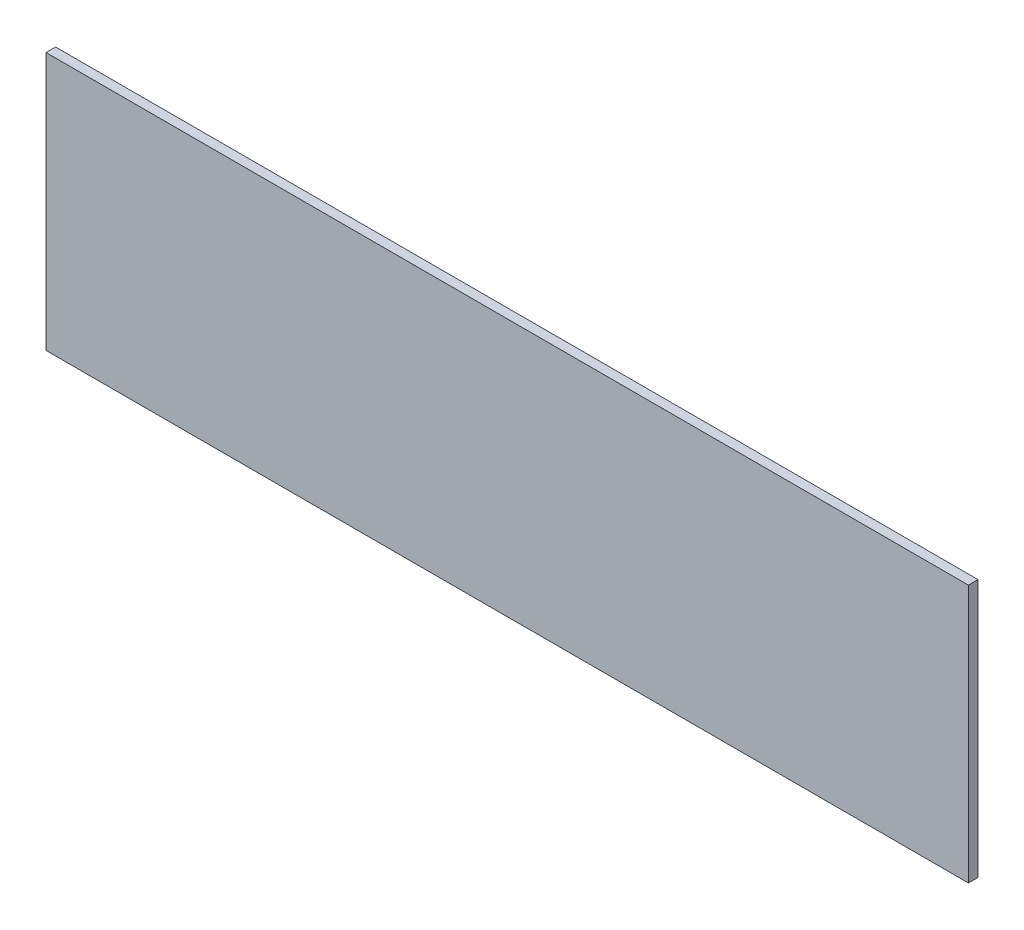
ISO-10303-21;
HEADER;
FILE_DESCRIPTION(('STEP AP214'),'2;1');
FILE_NAME('part.step','',(''),(''),'','','');
FILE_SCHEMA(('AUTOMOTIVE_DESIGN { 1 0 10303 214 1 1 1 1 }'));
ENDSEC;
DATA;
#1=APPLICATION_CONTEXT('core data for automotive mechanical design processes');
#2=APPLICATION_PROTOCOL_DEFINITION('international standard','automotive_design',2000,#1);
#3=PRODUCT_CONTEXT('',#1,'mechanical');
#4=PRODUCT('Part','Part','',(#3));
#5=PRODUCT_RELATED_PRODUCT_CATEGORY('part','',(#4));
#6=PRODUCT_DEFINITION_FORMATION('','',#4);
#7=PRODUCT_DEFINITION_CONTEXT('part definition',#1,'design');
#8=PRODUCT_DEFINITION('design','',#6,#7);
#9=PRODUCT_DEFINITION_SHAPE('','',#8);
#10=(LENGTH_UNIT() NAMED_UNIT(*) SI_UNIT(.MILLI.,.METRE.));
#11=(NAMED_UNIT(*) PLANE_ANGLE_UNIT() SI_UNIT($,.RADIAN.));
#12=(NAMED_UNIT(*) SI_UNIT($,.STERADIAN.) SOLID_ANGLE_UNIT());
#13=UNCERTAINTY_MEASURE_WITH_UNIT(LENGTH_MEASURE(1.E-05),#10,'distance_accuracy_value','');
#14=(GEOMETRIC_REPRESENTATION_CONTEXT(3) GLOBAL_UNCERTAINTY_ASSIGNED_CONTEXT((#13)) GLOBAL_UNIT_ASSIGNED_CONTEXT((#10,
#11,#12)) REPRESENTATION_CONTEXT('',''));
#15=CARTESIAN_POINT('',(0.,0.,0.));
#16=DIRECTION('',(0.,0.,1.));
#17=DIRECTION('',(1.,0.,0.));
#18=AXIS2_PLACEMENT_3D('',#15,#16,#17);
#19=CARTESIAN_POINT('',(153.025,42.8,3.175));
#20=DIRECTION('',(-1.,0.,0.));
#21=DIRECTION('',(0.,0.,1.));
#22=AXIS2_PLACEMENT_3D('',#19,#20,#21);
#23=PLANE('',#22);
#24=DIRECTION('',(0.,1.,0.));
#25=VECTOR('',#24,1.);
#26=CARTESIAN_POINT('',(153.025,42.8,0.));
#27=LINE('',#26,#25);
#28=CARTESIAN_POINT('',(153.025,-42.8,0.));
#29=VERTEX_POINT('',#28);
#30=CARTESIAN_POINT('',(153.025,42.8,0.));
#31=VERTEX_POINT('',#30);
#32=EDGE_CURVE('E99',#29,#31,#27,.T.);
#33=ORIENTED_EDGE('',*,*,#32,.T.);
#34=DIRECTION('',(0.,0.,-1.));
#35=VECTOR('',#34,1.);
#36=CARTESIAN_POINT('',(153.025,42.8,3.175));
#37=LINE('',#36,#35);
#38=CARTESIAN_POINT('',(153.025,42.8,3.175));
#39=VERTEX_POINT('',#38);
#40=EDGE_CURVE('E11',#39,#31,#37,.T.);
#41=ORIENTED_EDGE('',*,*,#40,.F.);
#42=DIRECTION('',(0.,1.,0.));
#43=VECTOR('',#42,1.);
#44=CARTESIAN_POINT('',(153.025,42.8,3.175));
#45=LINE('',#44,#43);
#46=CARTESIAN_POINT('',(153.025,-42.8,3.175));
#47=VERTEX_POINT('',#46);
#48=EDGE_CURVE('E87',#47,#39,#45,.T.);
#49=ORIENTED_EDGE('',*,*,#48,.F.);
#50=DIRECTION('',(0.,0.,-1.));
#51=VECTOR('',#50,1.);
#52=CARTESIAN_POINT('',(153.025,-42.8,3.175));
#53=LINE('',#52,#51);
#54=EDGE_CURVE('E95',#47,#29,#53,.T.);
#55=ORIENTED_EDGE('',*,*,#54,.T.);
#56=EDGE_LOOP('',(#33,#41,#49,#55));
#57=FACE_BOUND('',#56,.T.);
#58=ADVANCED_FACE('F36',(#57),#23,.F.);
#59=CARTESIAN_POINT('',(-153.025,42.8,3.175));
#60=DIRECTION('',(0.,-1.,0.));
#61=DIRECTION('',(0.,0.,-1.));
#62=AXIS2_PLACEMENT_3D('',#59,#60,#61);
#63=PLANE('',#62);
#64=DIRECTION('',(-1.,0.,0.));
#65=VECTOR('',#64,1.);
#66=CARTESIAN_POINT('',(-153.025,42.8,0.));
#67=LINE('',#66,#65);
#68=CARTESIAN_POINT('',(-153.025,42.8,0.));
#69=VERTEX_POINT('',#68);
#70=EDGE_CURVE('E91',#31,#69,#67,.T.);
#71=ORIENTED_EDGE('',*,*,#70,.T.);
#72=DIRECTION('',(0.,0.,-1.));
#73=VECTOR('',#72,1.);
#74=CARTESIAN_POINT('',(-153.025,42.8,3.175));
#75=LINE('',#74,#73);
#76=CARTESIAN_POINT('',(-153.025,42.8,3.175));
#77=VERTEX_POINT('',#76);
#78=EDGE_CURVE('E44',#77,#69,#75,.T.);
#79=ORIENTED_EDGE('',*,*,#78,.F.);
#80=DIRECTION('',(-1.,0.,0.));
#81=VECTOR('',#80,1.);
#82=CARTESIAN_POINT('',(-153.025,42.8,3.175));
#83=LINE('',#82,#81);
#84=EDGE_CURVE('E82',#39,#77,#83,.T.);
#85=ORIENTED_EDGE('',*,*,#84,.F.);
#86=ORIENTED_EDGE('',*,*,#40,.T.);
#87=EDGE_LOOP('',(#71,#79,#85,#86));
#88=FACE_BOUND('',#87,.T.);
#89=ADVANCED_FACE('F90',(#88),#63,.F.);
#90=CARTESIAN_POINT('',(-153.025,42.8,3.175));
#91=DIRECTION('',(1.,0.,0.));
#92=DIRECTION('',(0.,0.,-1.));
#93=AXIS2_PLACEMENT_3D('',#90,#91,#92);
#94=PLANE('',#93);
#95=DIRECTION('',(0.,-1.,0.));
#96=VECTOR('',#95,1.);
#97=CARTESIAN_POINT('',(-153.025,42.8,0.));
#98=LINE('',#97,#96);
#99=CARTESIAN_POINT('',(-153.025,-42.8,0.));
#100=VERTEX_POINT('',#99);
#101=EDGE_CURVE('E69',#69,#100,#98,.T.);
#102=ORIENTED_EDGE('',*,*,#101,.T.);
#103=DIRECTION('',(0.,0.,-1.));
#104=VECTOR('',#103,1.);
#105=CARTESIAN_POINT('',(-153.025,-42.8,3.175));
#106=LINE('',#105,#104);
#107=CARTESIAN_POINT('',(-153.025,-42.8,3.175));
#108=VERTEX_POINT('',#107);
#109=EDGE_CURVE('E92',#108,#100,#106,.T.);
#110=ORIENTED_EDGE('',*,*,#109,.F.);
#111=DIRECTION('',(0.,-1.,0.));
#112=VECTOR('',#111,1.);
#113=CARTESIAN_POINT('',(-153.025,42.8,3.175));
#114=LINE('',#113,#112);
#115=EDGE_CURVE('E85',#77,#108,#114,.T.);
#116=ORIENTED_EDGE('',*,*,#115,.F.);
#117=ORIENTED_EDGE('',*,*,#78,.T.);
#118=EDGE_LOOP('',(#102,#110,#116,#117));
#119=FACE_BOUND('',#118,.T.);
#120=ADVANCED_FACE('F93',(#119),#94,.F.);
#121=CARTESIAN_POINT('',(-153.025,-42.8,3.175));
#122=DIRECTION('',(0.,1.,0.));
#123=DIRECTION('',(0.,0.,1.));
#124=AXIS2_PLACEMENT_3D('',#121,#122,#123);
#125=PLANE('',#124);
#126=DIRECTION('',(1.,0.,0.));
#127=VECTOR('',#126,1.);
#128=CARTESIAN_POINT('',(-153.025,-42.8,0.));
#129=LINE('',#128,#127);
#130=EDGE_CURVE('E75',#100,#29,#129,.T.);
#131=ORIENTED_EDGE('',*,*,#130,.T.);
#132=ORIENTED_EDGE('',*,*,#54,.F.);
#133=DIRECTION('',(1.,0.,0.));
#134=VECTOR('',#133,1.);
#135=CARTESIAN_POINT('',(-153.025,-42.8,3.175));
#136=LINE('',#135,#134);
#137=EDGE_CURVE('E52',#108,#47,#136,.T.);
#138=ORIENTED_EDGE('',*,*,#137,.F.);
#139=ORIENTED_EDGE('',*,*,#109,.T.);
#140=EDGE_LOOP('',(#131,#132,#138,#139));
#141=FACE_BOUND('',#140,.T.);
#142=ADVANCED_FACE('F106',(#141),#125,.F.);
#143=CARTESIAN_POINT('',(0.,0.,3.175));
#144=DIRECTION('',(0.,0.,1.));
#145=DIRECTION('',(1.,0.,0.));
#146=AXIS2_PLACEMENT_3D('',#143,#144,#145);
#147=PLANE('',#146);
#148=ORIENTED_EDGE('',*,*,#48,.T.);
#149=ORIENTED_EDGE('',*,*,#84,.T.);
#150=ORIENTED_EDGE('',*,*,#115,.T.);
#151=ORIENTED_EDGE('',*,*,#137,.T.);
#152=EDGE_LOOP('',(#148,#149,#150,#151));
#153=FACE_BOUND('',#152,.T.);
#154=ADVANCED_FACE('F83',(#153),#147,.T.);
#155=CARTESIAN_POINT('',(0.,0.,0.));
#156=DIRECTION('',(0.,0.,1.));
#157=DIRECTION('',(1.,0.,0.));
#158=AXIS2_PLACEMENT_3D('',#155,#156,#157);
#159=PLANE('',#158);
#160=ORIENTED_EDGE('',*,*,#32,.F.);
#161=ORIENTED_EDGE('',*,*,#130,.F.);
#162=ORIENTED_EDGE('',*,*,#101,.F.);
#163=ORIENTED_EDGE('',*,*,#70,.F.);
#164=EDGE_LOOP('',(#160,#161,#162,#163));
#165=FACE_BOUND('',#164,.T.);
#166=ADVANCED_FACE('F109',(#165),#159,.F.);
#167=CLOSED_SHELL('',(#58,#89,#120,#142,#154,#166));
#168=MANIFOLD_SOLID_BREP('B2',#167);
#169=ADVANCED_BREP_SHAPE_REPRESENTATION('',(#18,#168),#14);
#170=SHAPE_DEFINITION_REPRESENTATION(#9,#169);
ENDSEC;
END-ISO-10303-21;
